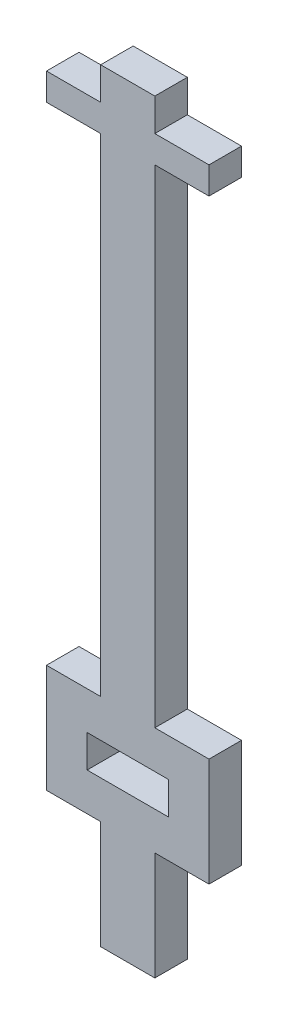
ISO-10303-21;
HEADER;
FILE_DESCRIPTION(('STEP AP214'),'2;1');
FILE_NAME('part.step','',(''),(''),'','','');
FILE_SCHEMA(('AUTOMOTIVE_DESIGN { 1 0 10303 214 1 1 1 1 }'));
ENDSEC;
DATA;
#1=APPLICATION_CONTEXT('core data for automotive mechanical design processes');
#2=APPLICATION_PROTOCOL_DEFINITION('international standard','automotive_design',2000,#1);
#3=PRODUCT_CONTEXT('',#1,'mechanical');
#4=PRODUCT('Part','Part','',(#3));
#5=PRODUCT_RELATED_PRODUCT_CATEGORY('part','',(#4));
#6=PRODUCT_DEFINITION_FORMATION('','',#4);
#7=PRODUCT_DEFINITION_CONTEXT('part definition',#1,'design');
#8=PRODUCT_DEFINITION('design','',#6,#7);
#9=PRODUCT_DEFINITION_SHAPE('','',#8);
#10=(LENGTH_UNIT() NAMED_UNIT(*) SI_UNIT(.MILLI.,.METRE.));
#11=(NAMED_UNIT(*) PLANE_ANGLE_UNIT() SI_UNIT($,.RADIAN.));
#12=(NAMED_UNIT(*) SI_UNIT($,.STERADIAN.) SOLID_ANGLE_UNIT());
#13=UNCERTAINTY_MEASURE_WITH_UNIT(LENGTH_MEASURE(1.E-05),#10,'distance_accuracy_value','');
#14=(GEOMETRIC_REPRESENTATION_CONTEXT(3) GLOBAL_UNCERTAINTY_ASSIGNED_CONTEXT((#13)) GLOBAL_UNIT_ASSIGNED_CONTEXT((#10,
#11,#12)) REPRESENTATION_CONTEXT('',''));
#15=CARTESIAN_POINT('',(0.,0.,0.));
#16=DIRECTION('',(0.,0.,1.));
#17=DIRECTION('',(1.,0.,0.));
#18=AXIS2_PLACEMENT_3D('',#15,#16,#17);
#19=CARTESIAN_POINT('',(0.,165.1,7.62));
#20=DIRECTION('',(1.,0.,0.));
#21=DIRECTION('',(0.,1.,0.));
#22=AXIS2_PLACEMENT_3D('',#19,#20,#21);
#23=PLANE('',#22);
#24=DIRECTION('',(0.,-1.,0.));
#25=VECTOR('',#24,1.);
#26=CARTESIAN_POINT('',(0.,165.1,7.62));
#27=LINE('',#26,#25);
#28=CARTESIAN_POINT('',(0.,25.4,7.62));
#29=VERTEX_POINT('',#28);
#30=CARTESIAN_POINT('',(0.,0.,7.62));
#31=VERTEX_POINT('',#30);
#32=EDGE_CURVE('E285',#29,#31,#27,.T.);
#33=ORIENTED_EDGE('',*,*,#32,.F.);
#34=DIRECTION('',(0.,0.,-1.));
#35=VECTOR('',#34,1.);
#36=CARTESIAN_POINT('',(0.,25.4,7.62));
#37=LINE('',#36,#35);
#38=CARTESIAN_POINT('',(0.,25.4,0.));
#39=VERTEX_POINT('',#38);
#40=EDGE_CURVE('E277',#29,#39,#37,.T.);
#41=ORIENTED_EDGE('',*,*,#40,.T.);
#42=DIRECTION('',(0.,-1.,0.));
#43=VECTOR('',#42,1.);
#44=CARTESIAN_POINT('',(0.,165.1,0.));
#45=LINE('',#44,#43);
#46=CARTESIAN_POINT('',(0.,0.,0.));
#47=VERTEX_POINT('',#46);
#48=EDGE_CURVE('E280',#39,#47,#45,.T.);
#49=ORIENTED_EDGE('',*,*,#48,.T.);
#50=DIRECTION('',(0.,0.,-1.));
#51=VECTOR('',#50,1.);
#52=CARTESIAN_POINT('',(0.,0.,7.62));
#53=LINE('',#52,#51);
#54=EDGE_CURVE('E11',#31,#47,#53,.T.);
#55=ORIENTED_EDGE('',*,*,#54,.F.);
#56=EDGE_LOOP('',(#33,#41,#49,#55));
#57=FACE_BOUND('',#56,.T.);
#58=ADVANCED_FACE('F33',(#57),#23,.F.);
#59=CARTESIAN_POINT('',(12.7,0.,7.62));
#60=DIRECTION('',(-1.,0.,0.));
#61=DIRECTION('',(0.,0.,1.));
#62=AXIS2_PLACEMENT_3D('',#59,#60,#61);
#63=PLANE('',#62);
#64=DIRECTION('',(0.,1.,0.));
#65=VECTOR('',#64,1.);
#66=CARTESIAN_POINT('',(12.7,0.,0.));
#67=LINE('',#66,#65);
#68=CARTESIAN_POINT('',(12.7,0.,0.));
#69=VERTEX_POINT('',#68);
#70=CARTESIAN_POINT('',(12.7,25.4,0.));
#71=VERTEX_POINT('',#70);
#72=EDGE_CURVE('E316',#69,#71,#67,.T.);
#73=ORIENTED_EDGE('',*,*,#72,.T.);
#74=DIRECTION('',(0.,0.,1.));
#75=VECTOR('',#74,1.);
#76=CARTESIAN_POINT('',(12.7,25.4,7.62));
#77=LINE('',#76,#75);
#78=CARTESIAN_POINT('',(12.7,25.4,7.62));
#79=VERTEX_POINT('',#78);
#80=EDGE_CURVE('E274',#71,#79,#77,.T.);
#81=ORIENTED_EDGE('',*,*,#80,.T.);
#82=DIRECTION('',(0.,1.,0.));
#83=VECTOR('',#82,1.);
#84=CARTESIAN_POINT('',(12.7,0.,7.62));
#85=LINE('',#84,#83);
#86=CARTESIAN_POINT('',(12.7,0.,7.62));
#87=VERTEX_POINT('',#86);
#88=EDGE_CURVE('E288',#87,#79,#85,.T.);
#89=ORIENTED_EDGE('',*,*,#88,.F.);
#90=DIRECTION('',(0.,0.,-1.));
#91=VECTOR('',#90,1.);
#92=CARTESIAN_POINT('',(12.7,0.,7.62));
#93=LINE('',#92,#91);
#94=EDGE_CURVE('E41',#87,#69,#93,.T.);
#95=ORIENTED_EDGE('',*,*,#94,.T.);
#96=EDGE_LOOP('',(#73,#81,#89,#95));
#97=FACE_BOUND('',#96,.T.);
#98=ADVANCED_FACE('F370',(#97),#63,.F.);
#99=CARTESIAN_POINT('',(0.,165.1,0.));
#100=VERTEX_POINT('',#99);
#101=CARTESIAN_POINT('',(0.,50.8,0.));
#102=VERTEX_POINT('',#101);
#103=EDGE_CURVE('E310',#100,#102,#45,.T.);
#104=ORIENTED_EDGE('',*,*,#103,.T.);
#105=DIRECTION('',(0.,0.,1.));
#106=VECTOR('',#105,1.);
#107=CARTESIAN_POINT('',(0.,50.8,7.62));
#108=LINE('',#107,#106);
#109=CARTESIAN_POINT('',(0.,50.8,7.62));
#110=VERTEX_POINT('',#109);
#111=EDGE_CURVE('E271',#102,#110,#108,.T.);
#112=ORIENTED_EDGE('',*,*,#111,.T.);
#113=CARTESIAN_POINT('',(0.,165.1,7.62));
#114=VERTEX_POINT('',#113);
#115=EDGE_CURVE('E281',#114,#110,#27,.T.);
#116=ORIENTED_EDGE('',*,*,#115,.F.);
#117=DIRECTION('',(0.,0.,-1.));
#118=VECTOR('',#117,1.);
#119=CARTESIAN_POINT('',(0.,165.1,7.62));
#120=LINE('',#119,#118);
#121=EDGE_CURVE('E309',#114,#100,#120,.T.);
#122=ORIENTED_EDGE('',*,*,#121,.T.);
#123=EDGE_LOOP('',(#104,#112,#116,#122));
#124=FACE_BOUND('',#123,.T.);
#125=ADVANCED_FACE('F35',(#124),#23,.F.);
#126=CARTESIAN_POINT('',(0.,0.,7.62));
#127=DIRECTION('',(0.,1.,0.));
#128=DIRECTION('',(0.,0.,1.));
#129=AXIS2_PLACEMENT_3D('',#126,#127,#128);
#130=PLANE('',#129);
#131=DIRECTION('',(1.,0.,0.));
#132=VECTOR('',#131,1.);
#133=CARTESIAN_POINT('',(0.,0.,0.));
#134=LINE('',#133,#132);
#135=EDGE_CURVE('E313',#47,#69,#134,.T.);
#136=ORIENTED_EDGE('',*,*,#135,.T.);
#137=ORIENTED_EDGE('',*,*,#94,.F.);
#138=DIRECTION('',(1.,0.,0.));
#139=VECTOR('',#138,1.);
#140=CARTESIAN_POINT('',(0.,0.,7.62));
#141=LINE('',#140,#139);
#142=EDGE_CURVE('E284',#31,#87,#141,.T.);
#143=ORIENTED_EDGE('',*,*,#142,.F.);
#144=ORIENTED_EDGE('',*,*,#54,.T.);
#145=EDGE_LOOP('',(#136,#137,#143,#144));
#146=FACE_BOUND('',#145,.T.);
#147=ADVANCED_FACE('F386',(#146),#130,.F.);
#148=CARTESIAN_POINT('',(12.7,50.8,7.62));
#149=VERTEX_POINT('',#148);
#150=CARTESIAN_POINT('',(12.7,165.1,7.62));
#151=VERTEX_POINT('',#150);
#152=EDGE_CURVE('E287',#149,#151,#85,.T.);
#153=ORIENTED_EDGE('',*,*,#152,.F.);
#154=DIRECTION('',(0.,0.,-1.));
#155=VECTOR('',#154,1.);
#156=CARTESIAN_POINT('',(12.7,50.8,7.62));
#157=LINE('',#156,#155);
#158=CARTESIAN_POINT('',(12.7,50.8,0.));
#159=VERTEX_POINT('',#158);
#160=EDGE_CURVE('E257',#149,#159,#157,.T.);
#161=ORIENTED_EDGE('',*,*,#160,.T.);
#162=CARTESIAN_POINT('',(12.7,165.1,0.));
#163=VERTEX_POINT('',#162);
#164=EDGE_CURVE('E315',#159,#163,#67,.T.);
#165=ORIENTED_EDGE('',*,*,#164,.T.);
#166=DIRECTION('',(0.,0.,-1.));
#167=VECTOR('',#166,1.);
#168=CARTESIAN_POINT('',(12.7,165.1,7.62));
#169=LINE('',#168,#167);
#170=EDGE_CURVE('E363',#151,#163,#169,.T.);
#171=ORIENTED_EDGE('',*,*,#170,.F.);
#172=EDGE_LOOP('',(#153,#161,#165,#171));
#173=FACE_BOUND('',#172,.T.);
#174=ADVANCED_FACE('F450',(#173),#63,.F.);
#175=CARTESIAN_POINT('',(12.7,165.1,7.62));
#176=DIRECTION('',(0.,1.,0.));
#177=DIRECTION('',(-1.,0.,0.));
#178=AXIS2_PLACEMENT_3D('',#175,#176,#177);
#179=PLANE('',#178);
#180=DIRECTION('',(1.,0.,0.));
#181=VECTOR('',#180,1.);
#182=CARTESIAN_POINT('',(12.7,165.1,0.));
#183=LINE('',#182,#181);
#184=CARTESIAN_POINT('',(25.4,165.1,0.));
#185=VERTEX_POINT('',#184);
#186=EDGE_CURVE('E319',#163,#185,#183,.T.);
#187=ORIENTED_EDGE('',*,*,#186,.T.);
#188=DIRECTION('',(0.,0.,-1.));
#189=VECTOR('',#188,1.);
#190=CARTESIAN_POINT('',(25.4,165.1,7.62));
#191=LINE('',#190,#189);
#192=CARTESIAN_POINT('',(25.4,165.1,7.62));
#193=VERTEX_POINT('',#192);
#194=EDGE_CURVE('E360',#193,#185,#191,.T.);
#195=ORIENTED_EDGE('',*,*,#194,.F.);
#196=DIRECTION('',(1.,0.,0.));
#197=VECTOR('',#196,1.);
#198=CARTESIAN_POINT('',(12.7,165.1,7.62));
#199=LINE('',#198,#197);
#200=EDGE_CURVE('E291',#151,#193,#199,.T.);
#201=ORIENTED_EDGE('',*,*,#200,.F.);
#202=ORIENTED_EDGE('',*,*,#170,.T.);
#203=EDGE_LOOP('',(#187,#195,#201,#202));
#204=FACE_BOUND('',#203,.T.);
#205=ADVANCED_FACE('F446',(#204),#179,.F.);
#206=CARTESIAN_POINT('',(25.4,165.1,7.62));
#207=DIRECTION('',(-1.,0.,0.));
#208=DIRECTION('',(0.,-1.,0.));
#209=AXIS2_PLACEMENT_3D('',#206,#207,#208);
#210=PLANE('',#209);
#211=DIRECTION('',(0.,1.,0.));
#212=VECTOR('',#211,1.);
#213=CARTESIAN_POINT('',(25.4,165.1,0.));
#214=LINE('',#213,#212);
#215=CARTESIAN_POINT('',(25.4,171.45,0.));
#216=VERTEX_POINT('',#215);
#217=EDGE_CURVE('E321',#185,#216,#214,.T.);
#218=ORIENTED_EDGE('',*,*,#217,.T.);
#219=DIRECTION('',(0.,0.,-1.));
#220=VECTOR('',#219,1.);
#221=CARTESIAN_POINT('',(25.4,171.45,7.62));
#222=LINE('',#221,#220);
#223=CARTESIAN_POINT('',(25.4,171.45,7.62));
#224=VERTEX_POINT('',#223);
#225=EDGE_CURVE('E357',#224,#216,#222,.T.);
#226=ORIENTED_EDGE('',*,*,#225,.F.);
#227=DIRECTION('',(0.,1.,0.));
#228=VECTOR('',#227,1.);
#229=CARTESIAN_POINT('',(25.4,165.1,7.62));
#230=LINE('',#229,#228);
#231=EDGE_CURVE('E293',#193,#224,#230,.T.);
#232=ORIENTED_EDGE('',*,*,#231,.F.);
#233=ORIENTED_EDGE('',*,*,#194,.T.);
#234=EDGE_LOOP('',(#218,#226,#232,#233));
#235=FACE_BOUND('',#234,.T.);
#236=ADVANCED_FACE('F441',(#235),#210,.F.);
#237=CARTESIAN_POINT('',(25.4,171.45,7.62));
#238=DIRECTION('',(0.,-1.,0.));
#239=DIRECTION('',(0.,0.,-1.));
#240=AXIS2_PLACEMENT_3D('',#237,#238,#239);
#241=PLANE('',#240);
#242=DIRECTION('',(-1.,0.,0.));
#243=VECTOR('',#242,1.);
#244=CARTESIAN_POINT('',(25.4,171.45,0.));
#245=LINE('',#244,#243);
#246=CARTESIAN_POINT('',(12.7,171.45,0.));
#247=VERTEX_POINT('',#246);
#248=EDGE_CURVE('E323',#216,#247,#245,.T.);
#249=ORIENTED_EDGE('',*,*,#248,.T.);
#250=DIRECTION('',(0.,0.,-1.));
#251=VECTOR('',#250,1.);
#252=CARTESIAN_POINT('',(12.7,171.45,7.62));
#253=LINE('',#252,#251);
#254=CARTESIAN_POINT('',(12.7,171.45,7.62));
#255=VERTEX_POINT('',#254);
#256=EDGE_CURVE('E354',#255,#247,#253,.T.);
#257=ORIENTED_EDGE('',*,*,#256,.F.);
#258=DIRECTION('',(-1.,0.,0.));
#259=VECTOR('',#258,1.);
#260=CARTESIAN_POINT('',(25.4,171.45,7.62));
#261=LINE('',#260,#259);
#262=EDGE_CURVE('E295',#224,#255,#261,.T.);
#263=ORIENTED_EDGE('',*,*,#262,.F.);
#264=ORIENTED_EDGE('',*,*,#225,.T.);
#265=EDGE_LOOP('',(#249,#257,#263,#264));
#266=FACE_BOUND('',#265,.T.);
#267=ADVANCED_FACE('F436',(#266),#241,.F.);
#268=CARTESIAN_POINT('',(12.7,171.45,7.62));
#269=DIRECTION('',(-1.,0.,0.));
#270=DIRECTION('',(0.,0.,1.));
#271=AXIS2_PLACEMENT_3D('',#268,#269,#270);
#272=PLANE('',#271);
#273=DIRECTION('',(0.,1.,0.));
#274=VECTOR('',#273,1.);
#275=CARTESIAN_POINT('',(12.7,171.45,0.));
#276=LINE('',#275,#274);
#277=CARTESIAN_POINT('',(12.7,179.07,0.));
#278=VERTEX_POINT('',#277);
#279=EDGE_CURVE('E325',#247,#278,#276,.T.);
#280=ORIENTED_EDGE('',*,*,#279,.T.);
#281=DIRECTION('',(0.,0.,-1.));
#282=VECTOR('',#281,1.);
#283=CARTESIAN_POINT('',(12.7,179.07,7.62));
#284=LINE('',#283,#282);
#285=CARTESIAN_POINT('',(12.7,179.07,7.62));
#286=VERTEX_POINT('',#285);
#287=EDGE_CURVE('E351',#286,#278,#284,.T.);
#288=ORIENTED_EDGE('',*,*,#287,.F.);
#289=DIRECTION('',(0.,1.,0.));
#290=VECTOR('',#289,1.);
#291=CARTESIAN_POINT('',(12.7,171.45,7.62));
#292=LINE('',#291,#290);
#293=EDGE_CURVE('E297',#255,#286,#292,.T.);
#294=ORIENTED_EDGE('',*,*,#293,.F.);
#295=ORIENTED_EDGE('',*,*,#256,.T.);
#296=EDGE_LOOP('',(#280,#288,#294,#295));
#297=FACE_BOUND('',#296,.T.);
#298=ADVANCED_FACE('F432',(#297),#272,.F.);
#299=CARTESIAN_POINT('',(12.7,179.07,7.62));
#300=DIRECTION('',(0.,-1.,0.));
#301=DIRECTION('',(0.,0.,-1.));
#302=AXIS2_PLACEMENT_3D('',#299,#300,#301);
#303=PLANE('',#302);
#304=DIRECTION('',(-1.,0.,0.));
#305=VECTOR('',#304,1.);
#306=CARTESIAN_POINT('',(12.7,179.07,0.));
#307=LINE('',#306,#305);
#308=CARTESIAN_POINT('',(0.,179.07,0.));
#309=VERTEX_POINT('',#308);
#310=EDGE_CURVE('E327',#278,#309,#307,.T.);
#311=ORIENTED_EDGE('',*,*,#310,.T.);
#312=DIRECTION('',(0.,0.,-1.));
#313=VECTOR('',#312,1.);
#314=CARTESIAN_POINT('',(0.,179.07,7.62));
#315=LINE('',#314,#313);
#316=CARTESIAN_POINT('',(0.,179.07,7.62));
#317=VERTEX_POINT('',#316);
#318=EDGE_CURVE('E348',#317,#309,#315,.T.);
#319=ORIENTED_EDGE('',*,*,#318,.F.);
#320=DIRECTION('',(-1.,0.,0.));
#321=VECTOR('',#320,1.);
#322=CARTESIAN_POINT('',(12.7,179.07,7.62));
#323=LINE('',#322,#321);
#324=EDGE_CURVE('E299',#286,#317,#323,.T.);
#325=ORIENTED_EDGE('',*,*,#324,.F.);
#326=ORIENTED_EDGE('',*,*,#287,.T.);
#327=EDGE_LOOP('',(#311,#319,#325,#326));
#328=FACE_BOUND('',#327,.T.);
#329=ADVANCED_FACE('F427',(#328),#303,.F.);
#330=CARTESIAN_POINT('',(0.,179.07,7.62));
#331=DIRECTION('',(1.,0.,0.));
#332=DIRECTION('',(0.,1.,0.));
#333=AXIS2_PLACEMENT_3D('',#330,#331,#332);
#334=PLANE('',#333);
#335=DIRECTION('',(0.,-1.,0.));
#336=VECTOR('',#335,1.);
#337=CARTESIAN_POINT('',(0.,179.07,0.));
#338=LINE('',#337,#336);
#339=CARTESIAN_POINT('',(0.,171.45,0.));
#340=VERTEX_POINT('',#339);
#341=EDGE_CURVE('E329',#309,#340,#338,.T.);
#342=ORIENTED_EDGE('',*,*,#341,.T.);
#343=DIRECTION('',(0.,0.,-1.));
#344=VECTOR('',#343,1.);
#345=CARTESIAN_POINT('',(0.,171.45,7.62));
#346=LINE('',#345,#344);
#347=CARTESIAN_POINT('',(0.,171.45,7.62));
#348=VERTEX_POINT('',#347);
#349=EDGE_CURVE('E345',#348,#340,#346,.T.);
#350=ORIENTED_EDGE('',*,*,#349,.F.);
#351=DIRECTION('',(0.,-1.,0.));
#352=VECTOR('',#351,1.);
#353=CARTESIAN_POINT('',(0.,179.07,7.62));
#354=LINE('',#353,#352);
#355=EDGE_CURVE('E301',#317,#348,#354,.T.);
#356=ORIENTED_EDGE('',*,*,#355,.F.);
#357=ORIENTED_EDGE('',*,*,#318,.T.);
#358=EDGE_LOOP('',(#342,#350,#356,#357));
#359=FACE_BOUND('',#358,.T.);
#360=ADVANCED_FACE('F421',(#359),#334,.F.);
#361=CARTESIAN_POINT('',(0.,171.45,7.62));
#362=DIRECTION('',(0.,-1.,0.));
#363=DIRECTION('',(0.,0.,-1.));
#364=AXIS2_PLACEMENT_3D('',#361,#362,#363);
#365=PLANE('',#364);
#366=DIRECTION('',(-1.,0.,0.));
#367=VECTOR('',#366,1.);
#368=CARTESIAN_POINT('',(0.,171.45,0.));
#369=LINE('',#368,#367);
#370=CARTESIAN_POINT('',(-12.7,171.45,0.));
#371=VERTEX_POINT('',#370);
#372=EDGE_CURVE('E331',#340,#371,#369,.T.);
#373=ORIENTED_EDGE('',*,*,#372,.T.);
#374=DIRECTION('',(0.,0.,-1.));
#375=VECTOR('',#374,1.);
#376=CARTESIAN_POINT('',(-12.7,171.45,7.62));
#377=LINE('',#376,#375);
#378=CARTESIAN_POINT('',(-12.7,171.45,7.62));
#379=VERTEX_POINT('',#378);
#380=EDGE_CURVE('E342',#379,#371,#377,.T.);
#381=ORIENTED_EDGE('',*,*,#380,.F.);
#382=DIRECTION('',(-1.,0.,0.));
#383=VECTOR('',#382,1.);
#384=CARTESIAN_POINT('',(0.,171.45,7.62));
#385=LINE('',#384,#383);
#386=EDGE_CURVE('E303',#348,#379,#385,.T.);
#387=ORIENTED_EDGE('',*,*,#386,.F.);
#388=ORIENTED_EDGE('',*,*,#349,.T.);
#389=EDGE_LOOP('',(#373,#381,#387,#388));
#390=FACE_BOUND('',#389,.T.);
#391=ADVANCED_FACE('F417',(#390),#365,.F.);
#392=CARTESIAN_POINT('',(-12.7,171.45,7.62));
#393=DIRECTION('',(1.,0.,0.));
#394=DIRECTION('',(0.,1.,0.));
#395=AXIS2_PLACEMENT_3D('',#392,#393,#394);
#396=PLANE('',#395);
#397=DIRECTION('',(0.,-1.,0.));
#398=VECTOR('',#397,1.);
#399=CARTESIAN_POINT('',(-12.7,171.45,0.));
#400=LINE('',#399,#398);
#401=CARTESIAN_POINT('',(-12.7,165.1,0.));
#402=VERTEX_POINT('',#401);
#403=EDGE_CURVE('E333',#371,#402,#400,.T.);
#404=ORIENTED_EDGE('',*,*,#403,.T.);
#405=DIRECTION('',(0.,0.,-1.));
#406=VECTOR('',#405,1.);
#407=CARTESIAN_POINT('',(-12.7,165.1,7.62));
#408=LINE('',#407,#406);
#409=CARTESIAN_POINT('',(-12.7,165.1,7.62));
#410=VERTEX_POINT('',#409);
#411=EDGE_CURVE('E339',#410,#402,#408,.T.);
#412=ORIENTED_EDGE('',*,*,#411,.F.);
#413=DIRECTION('',(0.,-1.,0.));
#414=VECTOR('',#413,1.);
#415=CARTESIAN_POINT('',(-12.7,171.45,7.62));
#416=LINE('',#415,#414);
#417=EDGE_CURVE('E305',#379,#410,#416,.T.);
#418=ORIENTED_EDGE('',*,*,#417,.F.);
#419=ORIENTED_EDGE('',*,*,#380,.T.);
#420=EDGE_LOOP('',(#404,#412,#418,#419));
#421=FACE_BOUND('',#420,.T.);
#422=ADVANCED_FACE('F412',(#421),#396,.F.);
#423=CARTESIAN_POINT('',(-12.7,165.1,7.62));
#424=DIRECTION('',(0.,1.,0.));
#425=DIRECTION('',(0.,0.,1.));
#426=AXIS2_PLACEMENT_3D('',#423,#424,#425);
#427=PLANE('',#426);
#428=DIRECTION('',(1.,0.,0.));
#429=VECTOR('',#428,1.);
#430=CARTESIAN_POINT('',(-12.7,165.1,0.));
#431=LINE('',#430,#429);
#432=EDGE_CURVE('E335',#402,#100,#431,.T.);
#433=ORIENTED_EDGE('',*,*,#432,.T.);
#434=ORIENTED_EDGE('',*,*,#121,.F.);
#435=DIRECTION('',(1.,0.,0.));
#436=VECTOR('',#435,1.);
#437=CARTESIAN_POINT('',(-12.7,165.1,7.62));
#438=LINE('',#437,#436);
#439=EDGE_CURVE('E307',#410,#114,#438,.T.);
#440=ORIENTED_EDGE('',*,*,#439,.F.);
#441=ORIENTED_EDGE('',*,*,#411,.T.);
#442=EDGE_LOOP('',(#433,#434,#440,#441));
#443=FACE_BOUND('',#442,.T.);
#444=ADVANCED_FACE('F406',(#443),#427,.F.);
#445=CARTESIAN_POINT('',(0.,0.,7.62));
#446=DIRECTION('',(0.,0.,1.));
#447=DIRECTION('',(1.,0.,0.));
#448=AXIS2_PLACEMENT_3D('',#445,#446,#447);
#449=PLANE('',#448);
#450=DIRECTION('',(0.,1.,0.));
#451=VECTOR('',#450,1.);
#452=CARTESIAN_POINT('',(15.875,34.29,7.62));
#453=LINE('',#452,#451);
#454=CARTESIAN_POINT('',(15.875,34.29,7.62));
#455=VERTEX_POINT('',#454);
#456=CARTESIAN_POINT('',(15.875,41.91,7.62));
#457=VERTEX_POINT('',#456);
#458=EDGE_CURVE('E48',#455,#457,#453,.T.);
#459=ORIENTED_EDGE('',*,*,#458,.F.);
#460=DIRECTION('',(1.,0.,0.));
#461=VECTOR('',#460,1.);
#462=CARTESIAN_POINT('',(-3.175,34.29,7.62));
#463=LINE('',#462,#461);
#464=CARTESIAN_POINT('',(-3.175,34.29,7.62));
#465=VERTEX_POINT('',#464);
#466=EDGE_CURVE('E212',#465,#455,#463,.T.);
#467=ORIENTED_EDGE('',*,*,#466,.F.);
#468=DIRECTION('',(0.,-1.,0.));
#469=VECTOR('',#468,1.);
#470=CARTESIAN_POINT('',(-3.175,34.29,7.62));
#471=LINE('',#470,#469);
#472=CARTESIAN_POINT('',(-3.175,41.91,7.62));
#473=VERTEX_POINT('',#472);
#474=EDGE_CURVE('E215',#473,#465,#471,.T.);
#475=ORIENTED_EDGE('',*,*,#474,.F.);
#476=DIRECTION('',(-1.,0.,0.));
#477=VECTOR('',#476,1.);
#478=CARTESIAN_POINT('',(-3.175,41.91,7.62));
#479=LINE('',#478,#477);
#480=EDGE_CURVE('E221',#457,#473,#479,.T.);
#481=ORIENTED_EDGE('',*,*,#480,.F.);
#482=EDGE_LOOP('',(#459,#467,#475,#481));
#483=FACE_BOUND('',#482,.T.);
#484=ORIENTED_EDGE('',*,*,#115,.T.);
#485=DIRECTION('',(-1.,0.,0.));
#486=VECTOR('',#485,1.);
#487=CARTESIAN_POINT('',(25.4,50.8,7.62));
#488=LINE('',#487,#486);
#489=CARTESIAN_POINT('',(-12.7,50.8,7.62));
#490=VERTEX_POINT('',#489);
#491=EDGE_CURVE('E254',#110,#490,#488,.T.);
#492=ORIENTED_EDGE('',*,*,#491,.T.);
#493=DIRECTION('',(0.,1.,0.));
#494=VECTOR('',#493,1.);
#495=CARTESIAN_POINT('',(-12.7,50.8,7.62));
#496=LINE('',#495,#494);
#497=CARTESIAN_POINT('',(-12.7,25.4,7.62));
#498=VERTEX_POINT('',#497);
#499=EDGE_CURVE('E227',#498,#490,#496,.T.);
#500=ORIENTED_EDGE('',*,*,#499,.F.);
#501=DIRECTION('',(-1.,0.,0.));
#502=VECTOR('',#501,1.);
#503=CARTESIAN_POINT('',(25.4,25.4,7.62));
#504=LINE('',#503,#502);
#505=EDGE_CURVE('E258',#29,#498,#504,.T.);
#506=ORIENTED_EDGE('',*,*,#505,.F.);
#507=ORIENTED_EDGE('',*,*,#32,.T.);
#508=ORIENTED_EDGE('',*,*,#142,.T.);
#509=ORIENTED_EDGE('',*,*,#88,.T.);
#510=CARTESIAN_POINT('',(25.4,25.4,7.62));
#511=VERTEX_POINT('',#510);
#512=EDGE_CURVE('E255',#511,#79,#504,.T.);
#513=ORIENTED_EDGE('',*,*,#512,.F.);
#514=DIRECTION('',(0.,1.,0.));
#515=VECTOR('',#514,1.);
#516=CARTESIAN_POINT('',(25.4,50.8,7.62));
#517=LINE('',#516,#515);
#518=CARTESIAN_POINT('',(25.4,50.8,7.62));
#519=VERTEX_POINT('',#518);
#520=EDGE_CURVE('E242',#511,#519,#517,.T.);
#521=ORIENTED_EDGE('',*,*,#520,.T.);
#522=EDGE_CURVE('E266',#519,#149,#488,.T.);
#523=ORIENTED_EDGE('',*,*,#522,.T.);
#524=ORIENTED_EDGE('',*,*,#152,.T.);
#525=ORIENTED_EDGE('',*,*,#200,.T.);
#526=ORIENTED_EDGE('',*,*,#231,.T.);
#527=ORIENTED_EDGE('',*,*,#262,.T.);
#528=ORIENTED_EDGE('',*,*,#293,.T.);
#529=ORIENTED_EDGE('',*,*,#324,.T.);
#530=ORIENTED_EDGE('',*,*,#355,.T.);
#531=ORIENTED_EDGE('',*,*,#386,.T.);
#532=ORIENTED_EDGE('',*,*,#417,.T.);
#533=ORIENTED_EDGE('',*,*,#439,.T.);
#534=EDGE_LOOP('',(#484,#492,#500,#506,#507,#508,#509,#513,#521,#523,#524,#525,#526,#527,#528,
#529,#530,#531,#532,#533));
#535=FACE_BOUND('',#534,.T.);
#536=ADVANCED_FACE('F381',(#483,#535),#449,.T.);
#537=CARTESIAN_POINT('',(0.,0.,0.));
#538=DIRECTION('',(0.,0.,1.));
#539=DIRECTION('',(1.,0.,0.));
#540=AXIS2_PLACEMENT_3D('',#537,#538,#539);
#541=PLANE('',#540);
#542=DIRECTION('',(1.,0.,0.));
#543=VECTOR('',#542,1.);
#544=CARTESIAN_POINT('',(-3.175,34.29,0.));
#545=LINE('',#544,#543);
#546=CARTESIAN_POINT('',(-3.175,34.29,0.));
#547=VERTEX_POINT('',#546);
#548=CARTESIAN_POINT('',(15.875,34.29,0.));
#549=VERTEX_POINT('',#548);
#550=EDGE_CURVE('E202',#547,#549,#545,.T.);
#551=ORIENTED_EDGE('',*,*,#550,.T.);
#552=DIRECTION('',(0.,1.,0.));
#553=VECTOR('',#552,1.);
#554=CARTESIAN_POINT('',(15.875,34.29,0.));
#555=LINE('',#554,#553);
#556=CARTESIAN_POINT('',(15.875,41.91,0.));
#557=VERTEX_POINT('',#556);
#558=EDGE_CURVE('E196',#549,#557,#555,.T.);
#559=ORIENTED_EDGE('',*,*,#558,.T.);
#560=DIRECTION('',(-1.,0.,0.));
#561=VECTOR('',#560,1.);
#562=CARTESIAN_POINT('',(-3.175,41.91,0.));
#563=LINE('',#562,#561);
#564=CARTESIAN_POINT('',(-3.175,41.91,0.));
#565=VERTEX_POINT('',#564);
#566=EDGE_CURVE('E205',#557,#565,#563,.T.);
#567=ORIENTED_EDGE('',*,*,#566,.T.);
#568=DIRECTION('',(0.,-1.,0.));
#569=VECTOR('',#568,1.);
#570=CARTESIAN_POINT('',(-3.175,34.29,0.));
#571=LINE('',#570,#569);
#572=EDGE_CURVE('E56',#565,#547,#571,.T.);
#573=ORIENTED_EDGE('',*,*,#572,.T.);
#574=EDGE_LOOP('',(#551,#559,#567,#573));
#575=FACE_BOUND('',#574,.T.);
#576=ORIENTED_EDGE('',*,*,#164,.F.);
#577=DIRECTION('',(-1.,0.,0.));
#578=VECTOR('',#577,1.);
#579=CARTESIAN_POINT('',(25.4,50.8,0.));
#580=LINE('',#579,#578);
#581=CARTESIAN_POINT('',(25.4,50.8,0.));
#582=VERTEX_POINT('',#581);
#583=EDGE_CURVE('E263',#582,#159,#580,.T.);
#584=ORIENTED_EDGE('',*,*,#583,.F.);
#585=DIRECTION('',(0.,-1.,0.));
#586=VECTOR('',#585,1.);
#587=CARTESIAN_POINT('',(25.4,50.8,0.));
#588=LINE('',#587,#586);
#589=CARTESIAN_POINT('',(25.4,25.4,0.));
#590=VERTEX_POINT('',#589);
#591=EDGE_CURVE('E248',#582,#590,#588,.T.);
#592=ORIENTED_EDGE('',*,*,#591,.T.);
#593=DIRECTION('',(-1.,0.,0.));
#594=VECTOR('',#593,1.);
#595=CARTESIAN_POINT('',(25.4,25.4,0.));
#596=LINE('',#595,#594);
#597=EDGE_CURVE('E259',#590,#71,#596,.T.);
#598=ORIENTED_EDGE('',*,*,#597,.T.);
#599=ORIENTED_EDGE('',*,*,#72,.F.);
#600=ORIENTED_EDGE('',*,*,#135,.F.);
#601=ORIENTED_EDGE('',*,*,#48,.F.);
#602=CARTESIAN_POINT('',(-12.7,25.4,0.));
#603=VERTEX_POINT('',#602);
#604=EDGE_CURVE('E262',#39,#603,#596,.T.);
#605=ORIENTED_EDGE('',*,*,#604,.T.);
#606=DIRECTION('',(0.,-1.,0.));
#607=VECTOR('',#606,1.);
#608=CARTESIAN_POINT('',(-12.7,50.8,0.));
#609=LINE('',#608,#607);
#610=CARTESIAN_POINT('',(-12.7,50.8,0.));
#611=VERTEX_POINT('',#610);
#612=EDGE_CURVE('E236',#611,#603,#609,.T.);
#613=ORIENTED_EDGE('',*,*,#612,.F.);
#614=EDGE_CURVE('E265',#102,#611,#580,.T.);
#615=ORIENTED_EDGE('',*,*,#614,.F.);
#616=ORIENTED_EDGE('',*,*,#103,.F.);
#617=ORIENTED_EDGE('',*,*,#432,.F.);
#618=ORIENTED_EDGE('',*,*,#403,.F.);
#619=ORIENTED_EDGE('',*,*,#372,.F.);
#620=ORIENTED_EDGE('',*,*,#341,.F.);
#621=ORIENTED_EDGE('',*,*,#310,.F.);
#622=ORIENTED_EDGE('',*,*,#279,.F.);
#623=ORIENTED_EDGE('',*,*,#248,.F.);
#624=ORIENTED_EDGE('',*,*,#217,.F.);
#625=ORIENTED_EDGE('',*,*,#186,.F.);
#626=EDGE_LOOP('',(#576,#584,#592,#598,#599,#600,#601,#605,#613,#615,#616,#617,#618,#619,#620,
#621,#622,#623,#624,#625));
#627=FACE_BOUND('',#626,.T.);
#628=ADVANCED_FACE('F209',(#575,#627),#541,.F.);
#629=CARTESIAN_POINT('',(25.4,0.,0.));
#630=DIRECTION('',(-1.,0.,0.));
#631=DIRECTION('',(0.,-1.,0.));
#632=AXIS2_PLACEMENT_3D('',#629,#630,#631);
#633=PLANE('',#632);
#634=ORIENTED_EDGE('',*,*,#520,.F.);
#635=DIRECTION('',(0.,0.,1.));
#636=VECTOR('',#635,1.);
#637=CARTESIAN_POINT('',(25.4,25.4,0.));
#638=LINE('',#637,#636);
#639=EDGE_CURVE('E251',#590,#511,#638,.T.);
#640=ORIENTED_EDGE('',*,*,#639,.F.);
#641=ORIENTED_EDGE('',*,*,#591,.F.);
#642=DIRECTION('',(0.,0.,-1.));
#643=VECTOR('',#642,1.);
#644=CARTESIAN_POINT('',(25.4,50.8,0.));
#645=LINE('',#644,#643);
#646=EDGE_CURVE('E245',#519,#582,#645,.T.);
#647=ORIENTED_EDGE('',*,*,#646,.F.);
#648=EDGE_LOOP('',(#634,#640,#641,#647));
#649=FACE_BOUND('',#648,.T.);
#650=ADVANCED_FACE('F454',(#649),#633,.F.);
#651=CARTESIAN_POINT('',(25.4,50.8,0.));
#652=DIRECTION('',(0.,1.,0.));
#653=DIRECTION('',(-1.,0.,0.));
#654=AXIS2_PLACEMENT_3D('',#651,#652,#653);
#655=PLANE('',#654);
#656=ORIENTED_EDGE('',*,*,#160,.F.);
#657=ORIENTED_EDGE('',*,*,#522,.F.);
#658=ORIENTED_EDGE('',*,*,#646,.T.);
#659=ORIENTED_EDGE('',*,*,#583,.T.);
#660=EDGE_LOOP('',(#656,#657,#658,#659));
#661=FACE_BOUND('',#660,.T.);
#662=ADVANCED_FACE('F455',(#661),#655,.T.);
#663=CARTESIAN_POINT('',(25.4,25.4,0.));
#664=DIRECTION('',(0.,-1.,0.));
#665=DIRECTION('',(1.,0.,0.));
#666=AXIS2_PLACEMENT_3D('',#663,#664,#665);
#667=PLANE('',#666);
#668=ORIENTED_EDGE('',*,*,#80,.F.);
#669=ORIENTED_EDGE('',*,*,#597,.F.);
#670=ORIENTED_EDGE('',*,*,#639,.T.);
#671=ORIENTED_EDGE('',*,*,#512,.T.);
#672=EDGE_LOOP('',(#668,#669,#670,#671));
#673=FACE_BOUND('',#672,.T.);
#674=ADVANCED_FACE('F379',(#673),#667,.T.);
#675=ORIENTED_EDGE('',*,*,#40,.F.);
#676=ORIENTED_EDGE('',*,*,#505,.T.);
#677=DIRECTION('',(0.,0.,1.));
#678=VECTOR('',#677,1.);
#679=CARTESIAN_POINT('',(-12.7,25.4,0.));
#680=LINE('',#679,#678);
#681=EDGE_CURVE('E239',#603,#498,#680,.T.);
#682=ORIENTED_EDGE('',*,*,#681,.F.);
#683=ORIENTED_EDGE('',*,*,#604,.F.);
#684=EDGE_LOOP('',(#675,#676,#682,#683));
#685=FACE_BOUND('',#684,.T.);
#686=ADVANCED_FACE('F396',(#685),#667,.T.);
#687=ORIENTED_EDGE('',*,*,#111,.F.);
#688=ORIENTED_EDGE('',*,*,#614,.T.);
#689=DIRECTION('',(0.,0.,-1.));
#690=VECTOR('',#689,1.);
#691=CARTESIAN_POINT('',(-12.7,50.8,0.));
#692=LINE('',#691,#690);
#693=EDGE_CURVE('E233',#490,#611,#692,.T.);
#694=ORIENTED_EDGE('',*,*,#693,.F.);
#695=ORIENTED_EDGE('',*,*,#491,.F.);
#696=EDGE_LOOP('',(#687,#688,#694,#695));
#697=FACE_BOUND('',#696,.T.);
#698=ADVANCED_FACE('F399',(#697),#655,.T.);
#699=CARTESIAN_POINT('',(-12.7,0.,0.));
#700=DIRECTION('',(-1.,0.,0.));
#701=DIRECTION('',(0.,-1.,0.));
#702=AXIS2_PLACEMENT_3D('',#699,#700,#701);
#703=PLANE('',#702);
#704=ORIENTED_EDGE('',*,*,#499,.T.);
#705=ORIENTED_EDGE('',*,*,#693,.T.);
#706=ORIENTED_EDGE('',*,*,#612,.T.);
#707=ORIENTED_EDGE('',*,*,#681,.T.);
#708=EDGE_LOOP('',(#704,#705,#706,#707));
#709=FACE_BOUND('',#708,.T.);
#710=ADVANCED_FACE('F393',(#709),#703,.T.);
#711=CARTESIAN_POINT('',(15.875,34.29,0.));
#712=DIRECTION('',(1.,0.,0.));
#713=DIRECTION('',(0.,0.,-1.));
#714=AXIS2_PLACEMENT_3D('',#711,#712,#713);
#715=PLANE('',#714);
#716=ORIENTED_EDGE('',*,*,#458,.T.);
#717=DIRECTION('',(0.,0.,1.));
#718=VECTOR('',#717,1.);
#719=CARTESIAN_POINT('',(15.875,41.91,0.));
#720=LINE('',#719,#718);
#721=EDGE_CURVE('E192',#557,#457,#720,.T.);
#722=ORIENTED_EDGE('',*,*,#721,.F.);
#723=ORIENTED_EDGE('',*,*,#558,.F.);
#724=DIRECTION('',(0.,0.,1.));
#725=VECTOR('',#724,1.);
#726=CARTESIAN_POINT('',(15.875,34.29,0.));
#727=LINE('',#726,#725);
#728=EDGE_CURVE('E225',#549,#455,#727,.T.);
#729=ORIENTED_EDGE('',*,*,#728,.T.);
#730=EDGE_LOOP('',(#716,#722,#723,#729));
#731=FACE_BOUND('',#730,.T.);
#732=ADVANCED_FACE('F194',(#731),#715,.F.);
#733=CARTESIAN_POINT('',(-3.175,34.29,0.));
#734=DIRECTION('',(0.,-1.,0.));
#735=DIRECTION('',(0.,0.,-1.));
#736=AXIS2_PLACEMENT_3D('',#733,#734,#735);
#737=PLANE('',#736);
#738=ORIENTED_EDGE('',*,*,#466,.T.);
#739=ORIENTED_EDGE('',*,*,#728,.F.);
#740=ORIENTED_EDGE('',*,*,#550,.F.);
#741=DIRECTION('',(0.,0.,1.));
#742=VECTOR('',#741,1.);
#743=CARTESIAN_POINT('',(-3.175,34.29,0.));
#744=LINE('',#743,#742);
#745=EDGE_CURVE('E228',#547,#465,#744,.T.);
#746=ORIENTED_EDGE('',*,*,#745,.T.);
#747=EDGE_LOOP('',(#738,#739,#740,#746));
#748=FACE_BOUND('',#747,.T.);
#749=ADVANCED_FACE('F507',(#748),#737,.F.);
#750=CARTESIAN_POINT('',(-3.175,34.29,0.));
#751=DIRECTION('',(-1.,0.,0.));
#752=DIRECTION('',(0.,0.,1.));
#753=AXIS2_PLACEMENT_3D('',#750,#751,#752);
#754=PLANE('',#753);
#755=ORIENTED_EDGE('',*,*,#474,.T.);
#756=ORIENTED_EDGE('',*,*,#745,.F.);
#757=ORIENTED_EDGE('',*,*,#572,.F.);
#758=DIRECTION('',(0.,0.,1.));
#759=VECTOR('',#758,1.);
#760=CARTESIAN_POINT('',(-3.175,41.91,0.));
#761=LINE('',#760,#759);
#762=EDGE_CURVE('E201',#565,#473,#761,.T.);
#763=ORIENTED_EDGE('',*,*,#762,.T.);
#764=EDGE_LOOP('',(#755,#756,#757,#763));
#765=FACE_BOUND('',#764,.T.);
#766=ADVANCED_FACE('F505',(#765),#754,.F.);
#767=CARTESIAN_POINT('',(-3.175,41.91,0.));
#768=DIRECTION('',(0.,1.,0.));
#769=DIRECTION('',(0.,0.,1.));
#770=AXIS2_PLACEMENT_3D('',#767,#768,#769);
#771=PLANE('',#770);
#772=ORIENTED_EDGE('',*,*,#480,.T.);
#773=ORIENTED_EDGE('',*,*,#762,.F.);
#774=ORIENTED_EDGE('',*,*,#566,.F.);
#775=ORIENTED_EDGE('',*,*,#721,.T.);
#776=EDGE_LOOP('',(#772,#773,#774,#775));
#777=FACE_BOUND('',#776,.T.);
#778=ADVANCED_FACE('F206',(#777),#771,.F.);
#779=CLOSED_SHELL('',(#58,#98,#125,#147,#174,#205,#236,#267,#298,#329,#360,#391,#422,#444,#536,
#628,#650,#662,#674,#686,#698,#710,#732,#749,#766,#778));
#780=MANIFOLD_SOLID_BREP('B2',#779);
#781=ADVANCED_BREP_SHAPE_REPRESENTATION('',(#18,#780),#14);
#782=SHAPE_DEFINITION_REPRESENTATION(#9,#781);
ENDSEC;
END-ISO-10303-21;
